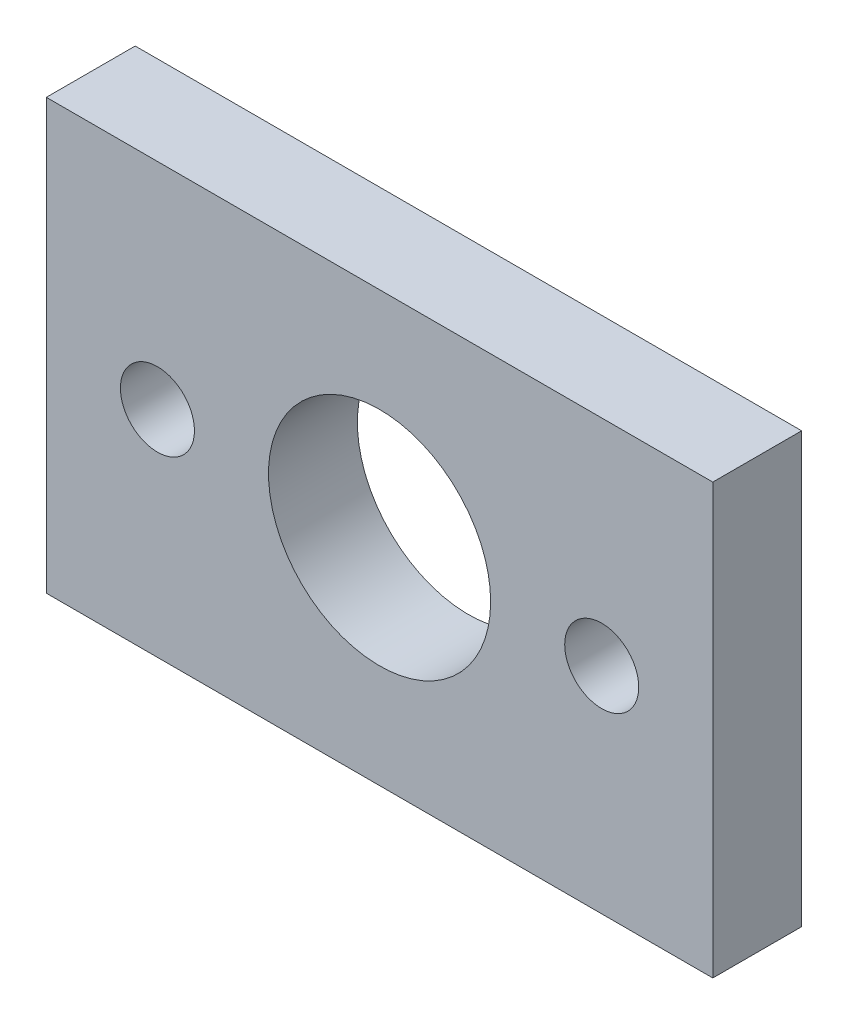
ISO-10303-21;
HEADER;
FILE_DESCRIPTION(('STEP AP214'),'2;1');
FILE_NAME('part.step','',(''),(''),'','','');
FILE_SCHEMA(('AUTOMOTIVE_DESIGN { 1 0 10303 214 1 1 1 1 }'));
ENDSEC;
DATA;
#1=APPLICATION_CONTEXT('core data for automotive mechanical design processes');
#2=APPLICATION_PROTOCOL_DEFINITION('international standard','automotive_design',2000,#1);
#3=PRODUCT_CONTEXT('',#1,'mechanical');
#4=PRODUCT('Part','Part','',(#3));
#5=PRODUCT_RELATED_PRODUCT_CATEGORY('part','',(#4));
#6=PRODUCT_DEFINITION_FORMATION('','',#4);
#7=PRODUCT_DEFINITION_CONTEXT('part definition',#1,'design');
#8=PRODUCT_DEFINITION('design','',#6,#7);
#9=PRODUCT_DEFINITION_SHAPE('','',#8);
#10=(LENGTH_UNIT() NAMED_UNIT(*) SI_UNIT(.MILLI.,.METRE.));
#11=(NAMED_UNIT(*) PLANE_ANGLE_UNIT() SI_UNIT($,.RADIAN.));
#12=(NAMED_UNIT(*) SI_UNIT($,.STERADIAN.) SOLID_ANGLE_UNIT());
#13=UNCERTAINTY_MEASURE_WITH_UNIT(LENGTH_MEASURE(1.E-05),#10,'distance_accuracy_value','');
#14=(GEOMETRIC_REPRESENTATION_CONTEXT(3) GLOBAL_UNCERTAINTY_ASSIGNED_CONTEXT((#13)) GLOBAL_UNIT_ASSIGNED_CONTEXT((#10,
#11,#12)) REPRESENTATION_CONTEXT('',''));
#15=CARTESIAN_POINT('',(0.,0.,0.));
#16=DIRECTION('',(0.,0.,1.));
#17=DIRECTION('',(1.,0.,0.));
#18=AXIS2_PLACEMENT_3D('',#15,#16,#17);
#19=CARTESIAN_POINT('',(0.,0.,6.));
#20=DIRECTION('',(0.,0.,-1.));
#21=DIRECTION('',(-1.,0.,0.));
#22=AXIS2_PLACEMENT_3D('',#19,#20,#21);
#23=PLANE('',#22);
#24=DIRECTION('',(0.,-1.,0.));
#25=VECTOR('',#24,1.);
#26=CARTESIAN_POINT('',(0.,0.,6.));
#27=LINE('',#26,#25);
#28=CARTESIAN_POINT('',(0.,29.,6.));
#29=VERTEX_POINT('',#28);
#30=CARTESIAN_POINT('',(0.,0.,6.));
#31=VERTEX_POINT('',#30);
#32=EDGE_CURVE('E89',#29,#31,#27,.T.);
#33=ORIENTED_EDGE('',*,*,#32,.T.);
#34=DIRECTION('',(1.,0.,0.));
#35=VECTOR('',#34,1.);
#36=CARTESIAN_POINT('',(0.,0.,6.));
#37=LINE('',#36,#35);
#38=CARTESIAN_POINT('',(45.,0.,6.));
#39=VERTEX_POINT('',#38);
#40=EDGE_CURVE('E84',#31,#39,#37,.T.);
#41=ORIENTED_EDGE('',*,*,#40,.T.);
#42=DIRECTION('',(0.,1.,0.));
#43=VECTOR('',#42,1.);
#44=CARTESIAN_POINT('',(45.,0.,6.));
#45=LINE('',#44,#43);
#46=CARTESIAN_POINT('',(45.,29.,6.));
#47=VERTEX_POINT('',#46);
#48=EDGE_CURVE('E87',#39,#47,#45,.T.);
#49=ORIENTED_EDGE('',*,*,#48,.T.);
#50=DIRECTION('',(-1.,0.,0.));
#51=VECTOR('',#50,1.);
#52=CARTESIAN_POINT('',(0.,29.,6.));
#53=LINE('',#52,#51);
#54=EDGE_CURVE('E54',#47,#29,#53,.T.);
#55=ORIENTED_EDGE('',*,*,#54,.T.);
#56=EDGE_LOOP('',(#33,#41,#49,#55));
#57=FACE_BOUND('',#56,.T.);
#58=CARTESIAN_POINT('',(22.5,14.5,6.));
#59=DIRECTION('',(0.,0.,1.));
#60=DIRECTION('',(1.,0.,0.));
#61=AXIS2_PLACEMENT_3D('',#58,#59,#60);
#62=CIRCLE('',#61,7.5);
#63=CARTESIAN_POINT('',(30.,14.5,6.));
#64=VERTEX_POINT('',#63);
#65=EDGE_CURVE('E104',#64,#64,#62,.T.);
#66=ORIENTED_EDGE('',*,*,#65,.F.);
#67=EDGE_LOOP('',(#66));
#68=FACE_BOUND('',#67,.T.);
#69=CARTESIAN_POINT('',(7.5,14.5,6.));
#70=DIRECTION('',(0.,0.,1.));
#71=DIRECTION('',(1.,0.,0.));
#72=AXIS2_PLACEMENT_3D('',#69,#70,#71);
#73=CIRCLE('',#72,2.5);
#74=CARTESIAN_POINT('',(10.,14.5,6.));
#75=VERTEX_POINT('',#74);
#76=EDGE_CURVE('E119',#75,#75,#73,.T.);
#77=ORIENTED_EDGE('',*,*,#76,.F.);
#78=EDGE_LOOP('',(#77));
#79=FACE_BOUND('',#78,.T.);
#80=CARTESIAN_POINT('',(37.5,14.5,6.));
#81=DIRECTION('',(0.,0.,1.));
#82=DIRECTION('',(-1.,0.,0.));
#83=AXIS2_PLACEMENT_3D('',#80,#81,#82);
#84=CIRCLE('',#83,2.5);
#85=CARTESIAN_POINT('',(35.,14.5,6.));
#86=VERTEX_POINT('',#85);
#87=EDGE_CURVE('E125',#86,#86,#84,.T.);
#88=ORIENTED_EDGE('',*,*,#87,.F.);
#89=EDGE_LOOP('',(#88));
#90=FACE_BOUND('',#89,.T.);
#91=ADVANCED_FACE('F37',(#57,#68,#79,#90),#23,.F.);
#92=CARTESIAN_POINT('',(0.,0.,0.));
#93=DIRECTION('',(0.,0.,-1.));
#94=DIRECTION('',(-1.,0.,0.));
#95=AXIS2_PLACEMENT_3D('',#92,#93,#94);
#96=PLANE('',#95);
#97=CARTESIAN_POINT('',(7.5,14.5,0.));
#98=DIRECTION('',(0.,0.,1.));
#99=DIRECTION('',(1.,0.,0.));
#100=AXIS2_PLACEMENT_3D('',#97,#98,#99);
#101=CIRCLE('',#100,2.5);
#102=CARTESIAN_POINT('',(10.,14.5,0.));
#103=VERTEX_POINT('',#102);
#104=EDGE_CURVE('E122',#103,#103,#101,.T.);
#105=ORIENTED_EDGE('',*,*,#104,.T.);
#106=EDGE_LOOP('',(#105));
#107=FACE_BOUND('',#106,.T.);
#108=DIRECTION('',(0.,-1.,0.));
#109=VECTOR('',#108,1.);
#110=CARTESIAN_POINT('',(0.,0.,0.));
#111=LINE('',#110,#109);
#112=CARTESIAN_POINT('',(0.,29.,0.));
#113=VERTEX_POINT('',#112);
#114=CARTESIAN_POINT('',(0.,0.,0.));
#115=VERTEX_POINT('',#114);
#116=EDGE_CURVE('E101',#113,#115,#111,.T.);
#117=ORIENTED_EDGE('',*,*,#116,.F.);
#118=DIRECTION('',(-1.,0.,0.));
#119=VECTOR('',#118,1.);
#120=CARTESIAN_POINT('',(0.,29.,0.));
#121=LINE('',#120,#119);
#122=CARTESIAN_POINT('',(45.,29.,0.));
#123=VERTEX_POINT('',#122);
#124=EDGE_CURVE('E77',#123,#113,#121,.T.);
#125=ORIENTED_EDGE('',*,*,#124,.F.);
#126=DIRECTION('',(0.,1.,0.));
#127=VECTOR('',#126,1.);
#128=CARTESIAN_POINT('',(45.,0.,0.));
#129=LINE('',#128,#127);
#130=CARTESIAN_POINT('',(45.,0.,0.));
#131=VERTEX_POINT('',#130);
#132=EDGE_CURVE('E71',#131,#123,#129,.T.);
#133=ORIENTED_EDGE('',*,*,#132,.F.);
#134=DIRECTION('',(1.,0.,0.));
#135=VECTOR('',#134,1.);
#136=CARTESIAN_POINT('',(0.,0.,0.));
#137=LINE('',#136,#135);
#138=EDGE_CURVE('E93',#115,#131,#137,.T.);
#139=ORIENTED_EDGE('',*,*,#138,.F.);
#140=EDGE_LOOP('',(#117,#125,#133,#139));
#141=FACE_BOUND('',#140,.T.);
#142=CARTESIAN_POINT('',(22.5,14.5,0.));
#143=DIRECTION('',(0.,0.,1.));
#144=DIRECTION('',(1.,0.,0.));
#145=AXIS2_PLACEMENT_3D('',#142,#143,#144);
#146=CIRCLE('',#145,7.5);
#147=CARTESIAN_POINT('',(30.,14.5,0.));
#148=VERTEX_POINT('',#147);
#149=EDGE_CURVE('E116',#148,#148,#146,.T.);
#150=ORIENTED_EDGE('',*,*,#149,.T.);
#151=EDGE_LOOP('',(#150));
#152=FACE_BOUND('',#151,.T.);
#153=CARTESIAN_POINT('',(37.5,14.5,0.));
#154=DIRECTION('',(0.,0.,1.));
#155=DIRECTION('',(-1.,0.,0.));
#156=AXIS2_PLACEMENT_3D('',#153,#154,#155);
#157=CIRCLE('',#156,2.5);
#158=CARTESIAN_POINT('',(35.,14.5,0.));
#159=VERTEX_POINT('',#158);
#160=EDGE_CURVE('E128',#159,#159,#157,.T.);
#161=ORIENTED_EDGE('',*,*,#160,.T.);
#162=EDGE_LOOP('',(#161));
#163=FACE_BOUND('',#162,.T.);
#164=ADVANCED_FACE('F112',(#107,#141,#152,#163),#96,.T.);
#165=CARTESIAN_POINT('',(0.,0.,6.));
#166=DIRECTION('',(1.,0.,0.));
#167=DIRECTION('',(0.,0.,-1.));
#168=AXIS2_PLACEMENT_3D('',#165,#166,#167);
#169=PLANE('',#168);
#170=ORIENTED_EDGE('',*,*,#116,.T.);
#171=DIRECTION('',(0.,0.,-1.));
#172=VECTOR('',#171,1.);
#173=CARTESIAN_POINT('',(0.,0.,6.));
#174=LINE('',#173,#172);
#175=EDGE_CURVE('E11',#31,#115,#174,.T.);
#176=ORIENTED_EDGE('',*,*,#175,.F.);
#177=ORIENTED_EDGE('',*,*,#32,.F.);
#178=DIRECTION('',(0.,0.,-1.));
#179=VECTOR('',#178,1.);
#180=CARTESIAN_POINT('',(0.,29.,6.));
#181=LINE('',#180,#179);
#182=EDGE_CURVE('E97',#29,#113,#181,.T.);
#183=ORIENTED_EDGE('',*,*,#182,.T.);
#184=EDGE_LOOP('',(#170,#176,#177,#183));
#185=FACE_BOUND('',#184,.T.);
#186=ADVANCED_FACE('F39',(#185),#169,.F.);
#187=CARTESIAN_POINT('',(0.,0.,6.));
#188=DIRECTION('',(0.,1.,0.));
#189=DIRECTION('',(0.,0.,1.));
#190=AXIS2_PLACEMENT_3D('',#187,#188,#189);
#191=PLANE('',#190);
#192=ORIENTED_EDGE('',*,*,#138,.T.);
#193=DIRECTION('',(0.,0.,-1.));
#194=VECTOR('',#193,1.);
#195=CARTESIAN_POINT('',(45.,0.,6.));
#196=LINE('',#195,#194);
#197=EDGE_CURVE('E46',#39,#131,#196,.T.);
#198=ORIENTED_EDGE('',*,*,#197,.F.);
#199=ORIENTED_EDGE('',*,*,#40,.F.);
#200=ORIENTED_EDGE('',*,*,#175,.T.);
#201=EDGE_LOOP('',(#192,#198,#199,#200));
#202=FACE_BOUND('',#201,.T.);
#203=ADVANCED_FACE('F92',(#202),#191,.F.);
#204=CARTESIAN_POINT('',(45.,0.,6.));
#205=DIRECTION('',(-1.,0.,0.));
#206=DIRECTION('',(0.,0.,1.));
#207=AXIS2_PLACEMENT_3D('',#204,#205,#206);
#208=PLANE('',#207);
#209=ORIENTED_EDGE('',*,*,#132,.T.);
#210=DIRECTION('',(0.,0.,-1.));
#211=VECTOR('',#210,1.);
#212=CARTESIAN_POINT('',(45.,29.,6.));
#213=LINE('',#212,#211);
#214=EDGE_CURVE('E94',#47,#123,#213,.T.);
#215=ORIENTED_EDGE('',*,*,#214,.F.);
#216=ORIENTED_EDGE('',*,*,#48,.F.);
#217=ORIENTED_EDGE('',*,*,#197,.T.);
#218=EDGE_LOOP('',(#209,#215,#216,#217));
#219=FACE_BOUND('',#218,.T.);
#220=ADVANCED_FACE('F95',(#219),#208,.F.);
#221=CARTESIAN_POINT('',(0.,29.,6.));
#222=DIRECTION('',(0.,-1.,0.));
#223=DIRECTION('',(0.,0.,-1.));
#224=AXIS2_PLACEMENT_3D('',#221,#222,#223);
#225=PLANE('',#224);
#226=ORIENTED_EDGE('',*,*,#124,.T.);
#227=ORIENTED_EDGE('',*,*,#182,.F.);
#228=ORIENTED_EDGE('',*,*,#54,.F.);
#229=ORIENTED_EDGE('',*,*,#214,.T.);
#230=EDGE_LOOP('',(#226,#227,#228,#229));
#231=FACE_BOUND('',#230,.T.);
#232=ADVANCED_FACE('F109',(#231),#225,.F.);
#233=CARTESIAN_POINT('',(22.5,14.5,6.));
#234=DIRECTION('',(0.,0.,-1.));
#235=DIRECTION('',(-1.,0.,0.));
#236=AXIS2_PLACEMENT_3D('',#233,#234,#235);
#237=CYLINDRICAL_SURFACE('',#236,7.5);
#238=ORIENTED_EDGE('',*,*,#65,.T.);
#239=EDGE_LOOP('',(#238));
#240=FACE_BOUND('',#239,.T.);
#241=ORIENTED_EDGE('',*,*,#149,.F.);
#242=EDGE_LOOP('',(#241));
#243=FACE_BOUND('',#242,.T.);
#244=ADVANCED_FACE('F145',(#240,#243),#237,.F.);
#245=CARTESIAN_POINT('',(7.5,14.5,6.));
#246=DIRECTION('',(0.,0.,-1.));
#247=DIRECTION('',(-1.,0.,0.));
#248=AXIS2_PLACEMENT_3D('',#245,#246,#247);
#249=CYLINDRICAL_SURFACE('',#248,2.5);
#250=ORIENTED_EDGE('',*,*,#76,.T.);
#251=EDGE_LOOP('',(#250));
#252=FACE_BOUND('',#251,.T.);
#253=ORIENTED_EDGE('',*,*,#104,.F.);
#254=EDGE_LOOP('',(#253));
#255=FACE_BOUND('',#254,.T.);
#256=ADVANCED_FACE('F199',(#252,#255),#249,.F.);
#257=CARTESIAN_POINT('',(37.5,14.5,6.));
#258=DIRECTION('',(0.,0.,-1.));
#259=DIRECTION('',(-1.,0.,0.));
#260=AXIS2_PLACEMENT_3D('',#257,#258,#259);
#261=CYLINDRICAL_SURFACE('',#260,2.5);
#262=ORIENTED_EDGE('',*,*,#87,.T.);
#263=EDGE_LOOP('',(#262));
#264=FACE_BOUND('',#263,.T.);
#265=ORIENTED_EDGE('',*,*,#160,.F.);
#266=EDGE_LOOP('',(#265));
#267=FACE_BOUND('',#266,.T.);
#268=ADVANCED_FACE('F134',(#264,#267),#261,.F.);
#269=CLOSED_SHELL('',(#91,#164,#186,#203,#220,#232,#244,#256,#268));
#270=MANIFOLD_SOLID_BREP('B2',#269);
#271=ADVANCED_BREP_SHAPE_REPRESENTATION('',(#18,#270),#14);
#272=SHAPE_DEFINITION_REPRESENTATION(#9,#271);
ENDSEC;
END-ISO-10303-21;
